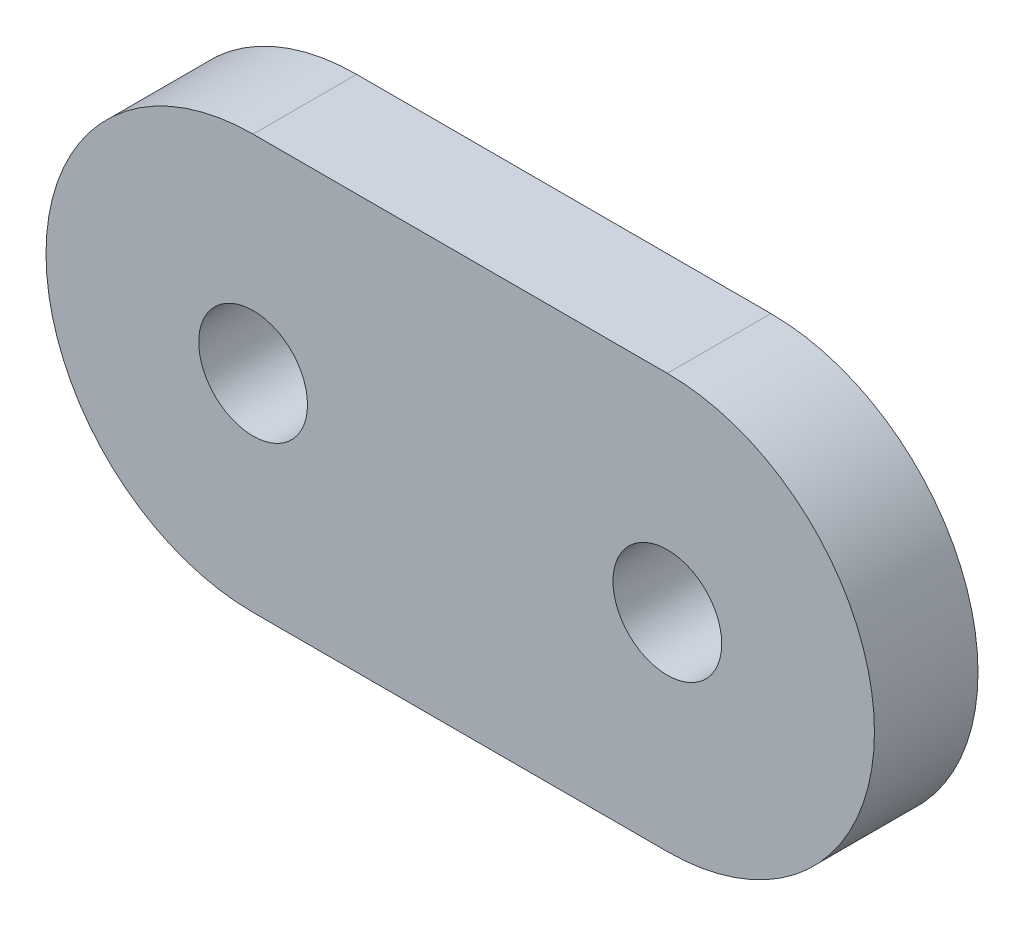
ISO-10303-21;
HEADER;
FILE_DESCRIPTION(('STEP AP214'),'2;1');
FILE_NAME('part.step','',(''),(''),'','','');
FILE_SCHEMA(('AUTOMOTIVE_DESIGN { 1 0 10303 214 1 1 1 1 }'));
ENDSEC;
DATA;
#1=APPLICATION_CONTEXT('core data for automotive mechanical design processes');
#2=APPLICATION_PROTOCOL_DEFINITION('international standard','automotive_design',2000,#1);
#3=PRODUCT_CONTEXT('',#1,'mechanical');
#4=PRODUCT('Part','Part','',(#3));
#5=PRODUCT_RELATED_PRODUCT_CATEGORY('part','',(#4));
#6=PRODUCT_DEFINITION_FORMATION('','',#4);
#7=PRODUCT_DEFINITION_CONTEXT('part definition',#1,'design');
#8=PRODUCT_DEFINITION('design','',#6,#7);
#9=PRODUCT_DEFINITION_SHAPE('','',#8);
#10=(LENGTH_UNIT() NAMED_UNIT(*) SI_UNIT(.MILLI.,.METRE.));
#11=(NAMED_UNIT(*) PLANE_ANGLE_UNIT() SI_UNIT($,.RADIAN.));
#12=(NAMED_UNIT(*) SI_UNIT($,.STERADIAN.) SOLID_ANGLE_UNIT());
#13=UNCERTAINTY_MEASURE_WITH_UNIT(LENGTH_MEASURE(1.E-05),#10,'distance_accuracy_value','');
#14=(GEOMETRIC_REPRESENTATION_CONTEXT(3) GLOBAL_UNCERTAINTY_ASSIGNED_CONTEXT((#13)) GLOBAL_UNIT_ASSIGNED_CONTEXT((#10,
#11,#12)) REPRESENTATION_CONTEXT('',''));
#15=CARTESIAN_POINT('',(0.,0.,0.));
#16=DIRECTION('',(0.,0.,1.));
#17=DIRECTION('',(1.,0.,0.));
#18=AXIS2_PLACEMENT_3D('',#15,#16,#17);
#19=CARTESIAN_POINT('',(-19.9908114436078,0.,-4.));
#20=DIRECTION('',(0.,0.,1.));
#21=DIRECTION('',(1.,0.,0.));
#22=AXIS2_PLACEMENT_3D('',#19,#20,#21);
#23=CYLINDRICAL_SURFACE('',#22,8.);
#24=CARTESIAN_POINT('',(-19.9908114436078,0.,0.));
#25=DIRECTION('',(0.,0.,1.));
#26=DIRECTION('',(1.,0.,0.));
#27=AXIS2_PLACEMENT_3D('',#24,#25,#26);
#28=CIRCLE('',#27,8.);
#29=CARTESIAN_POINT('',(-19.9908114436078,8.,0.));
#30=VERTEX_POINT('',#29);
#31=CARTESIAN_POINT('',(-19.9908114436078,-8.,0.));
#32=VERTEX_POINT('',#31);
#33=EDGE_CURVE('E117',#30,#32,#28,.T.);
#34=ORIENTED_EDGE('',*,*,#33,.F.);
#35=DIRECTION('',(0.,0.,1.));
#36=VECTOR('',#35,1.);
#37=CARTESIAN_POINT('',(-19.9908114436078,8.,-4.));
#38=LINE('',#37,#36);
#39=CARTESIAN_POINT('',(-19.9908114436078,8.,-4.));
#40=VERTEX_POINT('',#39);
#41=EDGE_CURVE('E13',#40,#30,#38,.T.);
#42=ORIENTED_EDGE('',*,*,#41,.F.);
#43=CARTESIAN_POINT('',(-19.9908114436078,0.,-4.));
#44=DIRECTION('',(0.,0.,1.));
#45=DIRECTION('',(1.,0.,0.));
#46=AXIS2_PLACEMENT_3D('',#43,#44,#45);
#47=CIRCLE('',#46,8.);
#48=CARTESIAN_POINT('',(-19.9908114436078,-8.,-4.));
#49=VERTEX_POINT('',#48);
#50=EDGE_CURVE('E110',#40,#49,#47,.T.);
#51=ORIENTED_EDGE('',*,*,#50,.T.);
#52=DIRECTION('',(0.,0.,1.));
#53=VECTOR('',#52,1.);
#54=CARTESIAN_POINT('',(-19.9908114436078,-8.,-4.));
#55=LINE('',#54,#53);
#56=EDGE_CURVE('E55',#49,#32,#55,.T.);
#57=ORIENTED_EDGE('',*,*,#56,.T.);
#58=EDGE_LOOP('',(#34,#42,#51,#57));
#59=FACE_BOUND('',#58,.T.);
#60=ADVANCED_FACE('F52',(#59),#23,.T.);
#61=CARTESIAN_POINT('',(-19.9908114436078,8.,-4.));
#62=DIRECTION('',(0.,1.,0.));
#63=DIRECTION('',(0.,0.,1.));
#64=AXIS2_PLACEMENT_3D('',#61,#62,#63);
#65=PLANE('',#64);
#66=DIRECTION('',(-1.,0.,0.));
#67=VECTOR('',#66,1.);
#68=CARTESIAN_POINT('',(-19.9908114436078,8.,0.));
#69=LINE('',#68,#67);
#70=CARTESIAN_POINT('',(-3.99081144360778,8.,0.));
#71=VERTEX_POINT('',#70);
#72=EDGE_CURVE('E112',#71,#30,#69,.T.);
#73=ORIENTED_EDGE('',*,*,#72,.F.);
#74=DIRECTION('',(0.,0.,1.));
#75=VECTOR('',#74,1.);
#76=CARTESIAN_POINT('',(-3.99081144360778,8.,-4.));
#77=LINE('',#76,#75);
#78=CARTESIAN_POINT('',(-3.99081144360778,8.,-4.));
#79=VERTEX_POINT('',#78);
#80=EDGE_CURVE('E61',#79,#71,#77,.T.);
#81=ORIENTED_EDGE('',*,*,#80,.F.);
#82=DIRECTION('',(-1.,0.,0.));
#83=VECTOR('',#82,1.);
#84=CARTESIAN_POINT('',(-19.9908114436078,8.,-4.));
#85=LINE('',#84,#83);
#86=EDGE_CURVE('E107',#79,#40,#85,.T.);
#87=ORIENTED_EDGE('',*,*,#86,.T.);
#88=ORIENTED_EDGE('',*,*,#41,.T.);
#89=EDGE_LOOP('',(#73,#81,#87,#88));
#90=FACE_BOUND('',#89,.T.);
#91=ADVANCED_FACE('F128',(#90),#65,.T.);
#92=CARTESIAN_POINT('',(-3.99081144360778,0.,-4.));
#93=DIRECTION('',(0.,0.,1.));
#94=DIRECTION('',(1.,0.,0.));
#95=AXIS2_PLACEMENT_3D('',#92,#93,#94);
#96=CYLINDRICAL_SURFACE('',#95,8.);
#97=CARTESIAN_POINT('',(-3.99081144360778,0.,0.));
#98=DIRECTION('',(0.,0.,1.));
#99=DIRECTION('',(1.,0.,0.));
#100=AXIS2_PLACEMENT_3D('',#97,#98,#99);
#101=CIRCLE('',#100,8.);
#102=CARTESIAN_POINT('',(-3.99081144360778,-8.,0.));
#103=VERTEX_POINT('',#102);
#104=EDGE_CURVE('E102',#103,#71,#101,.T.);
#105=ORIENTED_EDGE('',*,*,#104,.F.);
#106=DIRECTION('',(0.,0.,1.));
#107=VECTOR('',#106,1.);
#108=CARTESIAN_POINT('',(-3.99081144360778,-8.,-4.));
#109=LINE('',#108,#107);
#110=CARTESIAN_POINT('',(-3.99081144360778,-8.,-4.));
#111=VERTEX_POINT('',#110);
#112=EDGE_CURVE('E97',#111,#103,#109,.T.);
#113=ORIENTED_EDGE('',*,*,#112,.F.);
#114=CARTESIAN_POINT('',(-3.99081144360778,0.,-4.));
#115=DIRECTION('',(0.,0.,1.));
#116=DIRECTION('',(1.,0.,0.));
#117=AXIS2_PLACEMENT_3D('',#114,#115,#116);
#118=CIRCLE('',#117,8.);
#119=EDGE_CURVE('E100',#111,#79,#118,.T.);
#120=ORIENTED_EDGE('',*,*,#119,.T.);
#121=ORIENTED_EDGE('',*,*,#80,.T.);
#122=EDGE_LOOP('',(#105,#113,#120,#121));
#123=FACE_BOUND('',#122,.T.);
#124=ADVANCED_FACE('F99',(#123),#96,.T.);
#125=CARTESIAN_POINT('',(-19.9908114436078,-8.,-4.));
#126=DIRECTION('',(0.,-1.,0.));
#127=DIRECTION('',(0.,0.,-1.));
#128=AXIS2_PLACEMENT_3D('',#125,#126,#127);
#129=PLANE('',#128);
#130=DIRECTION('',(1.,0.,0.));
#131=VECTOR('',#130,1.);
#132=CARTESIAN_POINT('',(-19.9908114436078,-8.,0.));
#133=LINE('',#132,#131);
#134=EDGE_CURVE('E120',#32,#103,#133,.T.);
#135=ORIENTED_EDGE('',*,*,#134,.F.);
#136=ORIENTED_EDGE('',*,*,#56,.F.);
#137=DIRECTION('',(1.,0.,0.));
#138=VECTOR('',#137,1.);
#139=CARTESIAN_POINT('',(-19.9908114436078,-8.,-4.));
#140=LINE('',#139,#138);
#141=EDGE_CURVE('E106',#49,#111,#140,.T.);
#142=ORIENTED_EDGE('',*,*,#141,.T.);
#143=ORIENTED_EDGE('',*,*,#112,.T.);
#144=EDGE_LOOP('',(#135,#136,#142,#143));
#145=FACE_BOUND('',#144,.T.);
#146=ADVANCED_FACE('F109',(#145),#129,.T.);
#147=CARTESIAN_POINT('',(-19.9908114436078,0.,-4.));
#148=DIRECTION('',(0.,0.,1.));
#149=DIRECTION('',(1.,0.,0.));
#150=AXIS2_PLACEMENT_3D('',#147,#148,#149);
#151=PLANE('',#150);
#152=CARTESIAN_POINT('',(-19.9908114436078,0.,-4.));
#153=DIRECTION('',(0.,0.,1.));
#154=DIRECTION('',(1.,0.,0.));
#155=AXIS2_PLACEMENT_3D('',#152,#153,#154);
#156=CIRCLE('',#155,2.09999999999999);
#157=CARTESIAN_POINT('',(-17.8908114436078,0.,-4.));
#158=VERTEX_POINT('',#157);
#159=EDGE_CURVE('E164',#158,#158,#156,.T.);
#160=ORIENTED_EDGE('',*,*,#159,.T.);
#161=EDGE_LOOP('',(#160));
#162=FACE_BOUND('',#161,.T.);
#163=CARTESIAN_POINT('',(-3.99081144360778,0.,-4.));
#164=DIRECTION('',(0.,0.,1.));
#165=DIRECTION('',(1.,0.,0.));
#166=AXIS2_PLACEMENT_3D('',#163,#164,#165);
#167=CIRCLE('',#166,2.09999999999999);
#168=CARTESIAN_POINT('',(-1.89081144360779,0.,-4.));
#169=VERTEX_POINT('',#168);
#170=EDGE_CURVE('E121',#169,#169,#167,.T.);
#171=ORIENTED_EDGE('',*,*,#170,.T.);
#172=EDGE_LOOP('',(#171));
#173=FACE_BOUND('',#172,.T.);
#174=ORIENTED_EDGE('',*,*,#50,.F.);
#175=ORIENTED_EDGE('',*,*,#86,.F.);
#176=ORIENTED_EDGE('',*,*,#119,.F.);
#177=ORIENTED_EDGE('',*,*,#141,.F.);
#178=EDGE_LOOP('',(#174,#175,#176,#177));
#179=FACE_BOUND('',#178,.T.);
#180=ADVANCED_FACE('F105',(#162,#173,#179),#151,.F.);
#181=CARTESIAN_POINT('',(-19.9908114436078,0.,0.));
#182=DIRECTION('',(0.,0.,1.));
#183=DIRECTION('',(1.,0.,0.));
#184=AXIS2_PLACEMENT_3D('',#181,#182,#183);
#185=PLANE('',#184);
#186=CARTESIAN_POINT('',(-19.9908114436078,0.,0.));
#187=DIRECTION('',(0.,0.,1.));
#188=DIRECTION('',(1.,0.,0.));
#189=AXIS2_PLACEMENT_3D('',#186,#187,#188);
#190=CIRCLE('',#189,2.09999999999999);
#191=CARTESIAN_POINT('',(-17.8908114436078,0.,0.));
#192=VERTEX_POINT('',#191);
#193=EDGE_CURVE('E162',#192,#192,#190,.T.);
#194=ORIENTED_EDGE('',*,*,#193,.F.);
#195=EDGE_LOOP('',(#194));
#196=FACE_BOUND('',#195,.T.);
#197=CARTESIAN_POINT('',(-3.99081144360778,0.,0.));
#198=DIRECTION('',(0.,0.,1.));
#199=DIRECTION('',(1.,0.,0.));
#200=AXIS2_PLACEMENT_3D('',#197,#198,#199);
#201=CIRCLE('',#200,2.09999999999999);
#202=CARTESIAN_POINT('',(-1.89081144360779,0.,0.));
#203=VERTEX_POINT('',#202);
#204=EDGE_CURVE('E165',#203,#203,#201,.T.);
#205=ORIENTED_EDGE('',*,*,#204,.F.);
#206=EDGE_LOOP('',(#205));
#207=FACE_BOUND('',#206,.T.);
#208=ORIENTED_EDGE('',*,*,#33,.T.);
#209=ORIENTED_EDGE('',*,*,#134,.T.);
#210=ORIENTED_EDGE('',*,*,#104,.T.);
#211=ORIENTED_EDGE('',*,*,#72,.T.);
#212=EDGE_LOOP('',(#208,#209,#210,#211));
#213=FACE_BOUND('',#212,.T.);
#214=ADVANCED_FACE('F127',(#196,#207,#213),#185,.T.);
#215=CARTESIAN_POINT('',(-3.99081144360778,0.,0.));
#216=DIRECTION('',(0.,0.,1.));
#217=DIRECTION('',(1.,0.,0.));
#218=AXIS2_PLACEMENT_3D('',#215,#216,#217);
#219=CYLINDRICAL_SURFACE('',#218,2.09999999999999);
#220=ORIENTED_EDGE('',*,*,#204,.T.);
#221=EDGE_LOOP('',(#220));
#222=FACE_BOUND('',#221,.T.);
#223=ORIENTED_EDGE('',*,*,#170,.F.);
#224=EDGE_LOOP('',(#223));
#225=FACE_BOUND('',#224,.T.);
#226=ADVANCED_FACE('F146',(#222,#225),#219,.F.);
#227=CARTESIAN_POINT('',(-19.9908114436078,0.,0.));
#228=DIRECTION('',(0.,0.,1.));
#229=DIRECTION('',(1.,0.,0.));
#230=AXIS2_PLACEMENT_3D('',#227,#228,#229);
#231=CYLINDRICAL_SURFACE('',#230,2.09999999999999);
#232=ORIENTED_EDGE('',*,*,#193,.T.);
#233=EDGE_LOOP('',(#232));
#234=FACE_BOUND('',#233,.T.);
#235=ORIENTED_EDGE('',*,*,#159,.F.);
#236=EDGE_LOOP('',(#235));
#237=FACE_BOUND('',#236,.T.);
#238=ADVANCED_FACE('F153',(#234,#237),#231,.F.);
#239=CLOSED_SHELL('',(#60,#91,#124,#146,#180,#214,#226,#238));
#240=MANIFOLD_SOLID_BREP('B2',#239);
#241=ADVANCED_BREP_SHAPE_REPRESENTATION('',(#18,#240),#14);
#242=SHAPE_DEFINITION_REPRESENTATION(#9,#241);
ENDSEC;
END-ISO-10303-21;
